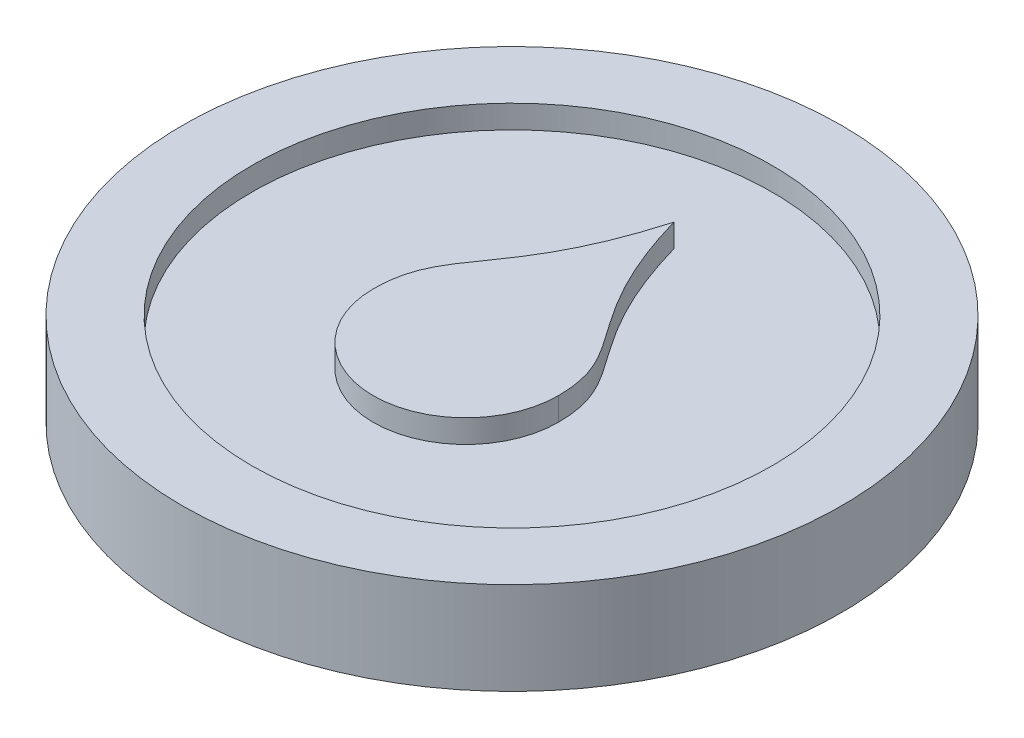
ISO-10303-21;
HEADER;
FILE_DESCRIPTION(('STEP AP214'),'2;1');
FILE_NAME('part.step','',(''),(''),'','','');
FILE_SCHEMA(('AUTOMOTIVE_DESIGN { 1 0 10303 214 1 1 1 1 }'));
ENDSEC;
DATA;
#1=APPLICATION_CONTEXT('core data for automotive mechanical design processes');
#2=APPLICATION_PROTOCOL_DEFINITION('international standard','automotive_design',2000,#1);
#3=PRODUCT_CONTEXT('',#1,'mechanical');
#4=PRODUCT('Part','Part','',(#3));
#5=PRODUCT_RELATED_PRODUCT_CATEGORY('part','',(#4));
#6=PRODUCT_DEFINITION_FORMATION('','',#4);
#7=PRODUCT_DEFINITION_CONTEXT('part definition',#1,'design');
#8=PRODUCT_DEFINITION('design','',#6,#7);
#9=PRODUCT_DEFINITION_SHAPE('','',#8);
#10=(LENGTH_UNIT() NAMED_UNIT(*) SI_UNIT(.MILLI.,.METRE.));
#11=(NAMED_UNIT(*) PLANE_ANGLE_UNIT() SI_UNIT($,.RADIAN.));
#12=(NAMED_UNIT(*) SI_UNIT($,.STERADIAN.) SOLID_ANGLE_UNIT());
#13=UNCERTAINTY_MEASURE_WITH_UNIT(LENGTH_MEASURE(1.E-05),#10,'distance_accuracy_value','');
#14=(GEOMETRIC_REPRESENTATION_CONTEXT(3) GLOBAL_UNCERTAINTY_ASSIGNED_CONTEXT((#13)) GLOBAL_UNIT_ASSIGNED_CONTEXT((#10,
#11,#12)) REPRESENTATION_CONTEXT('',''));
#15=CARTESIAN_POINT('',(0.,0.,0.));
#16=DIRECTION('',(0.,0.,1.));
#17=DIRECTION('',(1.,0.,0.));
#18=AXIS2_PLACEMENT_3D('',#15,#16,#17);
#19=CARTESIAN_POINT('',(0.,4.,0.));
#20=DIRECTION('',(0.,-1.,0.));
#21=DIRECTION('',(0.,0.,-1.));
#22=AXIS2_PLACEMENT_3D('',#19,#20,#21);
#23=CYLINDRICAL_SURFACE('',#22,14.25);
#24=CARTESIAN_POINT('',(0.,4.,0.));
#25=DIRECTION('',(0.,1.,0.));
#26=DIRECTION('',(0.,0.,1.));
#27=AXIS2_PLACEMENT_3D('',#24,#25,#26);
#28=CIRCLE('',#27,14.25);
#29=CARTESIAN_POINT('',(0.,4.,14.25));
#30=VERTEX_POINT('',#29);
#31=EDGE_CURVE('E11',#30,#30,#28,.T.);
#32=ORIENTED_EDGE('',*,*,#31,.F.);
#33=EDGE_LOOP('',(#32));
#34=FACE_BOUND('',#33,.T.);
#35=CARTESIAN_POINT('',(0.,0.,0.));
#36=DIRECTION('',(0.,1.,0.));
#37=DIRECTION('',(0.,0.,1.));
#38=AXIS2_PLACEMENT_3D('',#35,#36,#37);
#39=CIRCLE('',#38,14.25);
#40=CARTESIAN_POINT('',(0.,0.,14.25));
#41=VERTEX_POINT('',#40);
#42=EDGE_CURVE('E38',#41,#41,#39,.T.);
#43=ORIENTED_EDGE('',*,*,#42,.T.);
#44=EDGE_LOOP('',(#43));
#45=FACE_BOUND('',#44,.T.);
#46=ADVANCED_FACE('F35',(#34,#45),#23,.T.);
#47=CARTESIAN_POINT('',(0.,4.,0.));
#48=DIRECTION('',(0.,1.,0.));
#49=DIRECTION('',(0.,0.,1.));
#50=AXIS2_PLACEMENT_3D('',#47,#48,#49);
#51=PLANE('',#50);
#52=CARTESIAN_POINT('',(0.,4.,0.));
#53=DIRECTION('',(0.,1.,0.));
#54=DIRECTION('',(0.,0.,1.));
#55=AXIS2_PLACEMENT_3D('',#52,#53,#54);
#56=CIRCLE('',#55,11.25);
#57=CARTESIAN_POINT('',(0.,4.,11.25));
#58=VERTEX_POINT('',#57);
#59=EDGE_CURVE('E86',#58,#58,#56,.T.);
#60=ORIENTED_EDGE('',*,*,#59,.F.);
#61=EDGE_LOOP('',(#60));
#62=FACE_BOUND('',#61,.T.);
#63=ORIENTED_EDGE('',*,*,#31,.T.);
#64=EDGE_LOOP('',(#63));
#65=FACE_BOUND('',#64,.T.);
#66=ADVANCED_FACE('F105',(#62,#65),#51,.T.);
#67=CARTESIAN_POINT('',(0.,0.,0.));
#68=DIRECTION('',(0.,1.,0.));
#69=DIRECTION('',(0.,0.,1.));
#70=AXIS2_PLACEMENT_3D('',#67,#68,#69);
#71=PLANE('',#70);
#72=ORIENTED_EDGE('',*,*,#42,.F.);
#73=EDGE_LOOP('',(#72));
#74=FACE_BOUND('',#73,.T.);
#75=ADVANCED_FACE('F102',(#74),#71,.F.);
#76=CARTESIAN_POINT('',(0.,3.,0.));
#77=DIRECTION('',(0.,1.,0.));
#78=DIRECTION('',(0.,0.,1.));
#79=AXIS2_PLACEMENT_3D('',#76,#77,#78);
#80=CYLINDRICAL_SURFACE('',#79,11.25);
#81=CARTESIAN_POINT('',(0.,3.,0.));
#82=DIRECTION('',(0.,1.,0.));
#83=DIRECTION('',(0.,0.,1.));
#84=AXIS2_PLACEMENT_3D('',#81,#82,#83);
#85=CIRCLE('',#84,11.25);
#86=CARTESIAN_POINT('',(0.,3.,11.25));
#87=VERTEX_POINT('',#86);
#88=EDGE_CURVE('E89',#87,#87,#85,.T.);
#89=ORIENTED_EDGE('',*,*,#88,.F.);
#90=EDGE_LOOP('',(#89));
#91=FACE_BOUND('',#90,.T.);
#92=ORIENTED_EDGE('',*,*,#59,.T.);
#93=EDGE_LOOP('',(#92));
#94=FACE_BOUND('',#93,.T.);
#95=ADVANCED_FACE('F104',(#91,#94),#80,.F.);
#96=CARTESIAN_POINT('',(0.,3.,0.));
#97=DIRECTION('',(0.,1.,0.));
#98=DIRECTION('',(0.,0.,1.));
#99=AXIS2_PLACEMENT_3D('',#96,#97,#98);
#100=PLANE('',#99);
#101=CARTESIAN_POINT('',(0.,3.,-7.));
#102=CARTESIAN_POINT('',(-1.66053706284877,3.,-1.19697767223041));
#103=CARTESIAN_POINT('',(-4.,3.,-1.17143167959989));
#104=CARTESIAN_POINT('',(-4.,3.,2.));
#105=B_SPLINE_CURVE_WITH_KNOTS('',3,(#101,#102,#103,#104),.UNSPECIFIED.,.F.,.F.,(4,4),(0.,1.),.UNSPECIFIED.);
#106=CARTESIAN_POINT('',(0.,3.,-7.));
#107=VERTEX_POINT('',#106);
#108=CARTESIAN_POINT('',(-4.,3.,2.));
#109=VERTEX_POINT('',#108);
#110=EDGE_CURVE('E193',#107,#109,#105,.T.);
#111=ORIENTED_EDGE('',*,*,#110,.F.);
#112=CARTESIAN_POINT('',(4.,3.,2.));
#113=CARTESIAN_POINT('',(4.,3.,-1.17143167959989));
#114=CARTESIAN_POINT('',(1.66053706284877,3.,-1.19697767223041));
#115=CARTESIAN_POINT('',(0.,3.,-7.));
#116=B_SPLINE_CURVE_WITH_KNOTS('',3,(#112,#113,#114,#115),.UNSPECIFIED.,.F.,.F.,(4,4),(0.,1.),.UNSPECIFIED.);
#117=CARTESIAN_POINT('',(4.,3.,2.));
#118=VERTEX_POINT('',#117);
#119=EDGE_CURVE('E84',#118,#107,#116,.T.);
#120=ORIENTED_EDGE('',*,*,#119,.F.);
#121=CARTESIAN_POINT('',(0.,3.,2.));
#122=DIRECTION('',(0.,1.,0.));
#123=DIRECTION('',(0.,0.,1.));
#124=AXIS2_PLACEMENT_3D('',#121,#122,#123);
#125=CIRCLE('',#124,4.);
#126=EDGE_CURVE('E67',#109,#118,#125,.T.);
#127=ORIENTED_EDGE('',*,*,#126,.F.);
#128=EDGE_LOOP('',(#111,#120,#127));
#129=FACE_BOUND('',#128,.T.);
#130=ORIENTED_EDGE('',*,*,#88,.T.);
#131=EDGE_LOOP('',(#130));
#132=FACE_BOUND('',#131,.T.);
#133=ADVANCED_FACE('F110',(#129,#132),#100,.T.);
#134=CARTESIAN_POINT('',(4.,4.,2.));
#135=CARTESIAN_POINT('',(4.,4.,-1.17143167959989));
#136=CARTESIAN_POINT('',(1.66053706284877,4.,-1.19697767223041));
#137=CARTESIAN_POINT('',(0.,4.,-7.));
#138=B_SPLINE_CURVE_WITH_KNOTS('',3,(#134,#135,#136,#137),.UNSPECIFIED.,.F.,.F.,(4,4),(0.,1.),.UNSPECIFIED.);
#139=DIRECTION('',(0.,-1.,0.));
#140=VECTOR('',#139,1.);
#141=SURFACE_OF_LINEAR_EXTRUSION('',#138,#140);
#142=ORIENTED_EDGE('',*,*,#119,.T.);
#143=DIRECTION('',(0.,-1.,0.));
#144=VECTOR('',#143,1.);
#145=CARTESIAN_POINT('',(0.,4.,-7.));
#146=LINE('',#145,#144);
#147=CARTESIAN_POINT('',(0.,4.,-7.));
#148=VERTEX_POINT('',#147);
#149=EDGE_CURVE('E74',#148,#107,#146,.T.);
#150=ORIENTED_EDGE('',*,*,#149,.F.);
#151=CARTESIAN_POINT('',(4.,4.,2.));
#152=VERTEX_POINT('',#151);
#153=EDGE_CURVE('E76',#152,#148,#138,.T.);
#154=ORIENTED_EDGE('',*,*,#153,.F.);
#155=DIRECTION('',(0.,-1.,0.));
#156=VECTOR('',#155,1.);
#157=CARTESIAN_POINT('',(4.,4.,2.));
#158=LINE('',#157,#156);
#159=EDGE_CURVE('E91',#152,#118,#158,.T.);
#160=ORIENTED_EDGE('',*,*,#159,.T.);
#161=EDGE_LOOP('',(#142,#150,#154,#160));
#162=FACE_BOUND('',#161,.T.);
#163=ADVANCED_FACE('F82',(#162),#141,.F.);
#164=CARTESIAN_POINT('',(0.,4.,-7.));
#165=CARTESIAN_POINT('',(-1.66053706284877,4.,-1.19697767223041));
#166=CARTESIAN_POINT('',(-4.,4.,-1.17143167959989));
#167=CARTESIAN_POINT('',(-4.,4.,2.));
#168=B_SPLINE_CURVE_WITH_KNOTS('',3,(#164,#165,#166,#167),.UNSPECIFIED.,.F.,.F.,(4,4),(0.,1.),.UNSPECIFIED.);
#169=DIRECTION('',(0.,-1.,0.));
#170=VECTOR('',#169,1.);
#171=SURFACE_OF_LINEAR_EXTRUSION('',#168,#170);
#172=ORIENTED_EDGE('',*,*,#110,.T.);
#173=DIRECTION('',(0.,-1.,0.));
#174=VECTOR('',#173,1.);
#175=CARTESIAN_POINT('',(-4.,4.,2.));
#176=LINE('',#175,#174);
#177=CARTESIAN_POINT('',(-4.,4.,2.));
#178=VERTEX_POINT('',#177);
#179=EDGE_CURVE('E49',#178,#109,#176,.T.);
#180=ORIENTED_EDGE('',*,*,#179,.F.);
#181=EDGE_CURVE('E71',#148,#178,#168,.T.);
#182=ORIENTED_EDGE('',*,*,#181,.F.);
#183=ORIENTED_EDGE('',*,*,#149,.T.);
#184=EDGE_LOOP('',(#172,#180,#182,#183));
#185=FACE_BOUND('',#184,.T.);
#186=ADVANCED_FACE('F72',(#185),#171,.F.);
#187=CARTESIAN_POINT('',(0.,4.,2.));
#188=DIRECTION('',(0.,-1.,0.));
#189=DIRECTION('',(0.,0.,-1.));
#190=AXIS2_PLACEMENT_3D('',#187,#188,#189);
#191=CYLINDRICAL_SURFACE('',#190,4.);
#192=ORIENTED_EDGE('',*,*,#126,.T.);
#193=ORIENTED_EDGE('',*,*,#159,.F.);
#194=CARTESIAN_POINT('',(0.,4.,2.));
#195=DIRECTION('',(0.,1.,0.));
#196=DIRECTION('',(0.,0.,1.));
#197=AXIS2_PLACEMENT_3D('',#194,#195,#196);
#198=CIRCLE('',#197,4.);
#199=EDGE_CURVE('E57',#178,#152,#198,.T.);
#200=ORIENTED_EDGE('',*,*,#199,.F.);
#201=ORIENTED_EDGE('',*,*,#179,.T.);
#202=EDGE_LOOP('',(#192,#193,#200,#201));
#203=FACE_BOUND('',#202,.T.);
#204=ADVANCED_FACE('F159',(#203),#191,.T.);
#205=CARTESIAN_POINT('',(2.62270139856829,4.,-1.51315350693636));
#206=DIRECTION('',(0.,-1.,0.));
#207=DIRECTION('',(0.,0.,-1.));
#208=AXIS2_PLACEMENT_3D('',#205,#206,#207);
#209=PLANE('',#208);
#210=ORIENTED_EDGE('',*,*,#153,.T.);
#211=ORIENTED_EDGE('',*,*,#181,.T.);
#212=ORIENTED_EDGE('',*,*,#199,.T.);
#213=EDGE_LOOP('',(#210,#211,#212));
#214=FACE_BOUND('',#213,.T.);
#215=ADVANCED_FACE('F79',(#214),#209,.F.);
#216=CLOSED_SHELL('',(#46,#66,#75,#95,#133,#163,#186,#204,#215));
#217=MANIFOLD_SOLID_BREP('B2',#216);
#218=ADVANCED_BREP_SHAPE_REPRESENTATION('',(#18,#217),#14);
#219=SHAPE_DEFINITION_REPRESENTATION(#9,#218);
ENDSEC;
END-ISO-10303-21;
